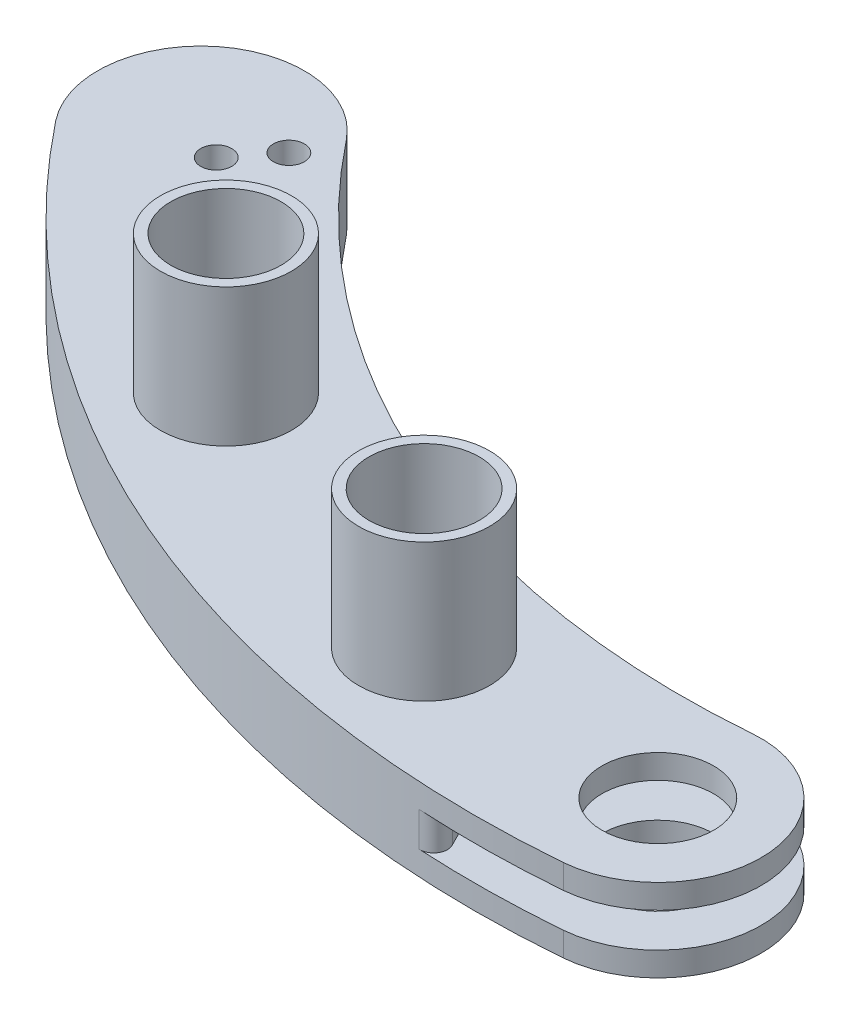
ISO-10303-21;
HEADER;
FILE_DESCRIPTION(('STEP AP214'),'2;1');
FILE_NAME('part.step','',(''),(''),'','','');
FILE_SCHEMA(('AUTOMOTIVE_DESIGN { 1 0 10303 214 1 1 1 1 }'));
ENDSEC;
DATA;
#1=APPLICATION_CONTEXT('core data for automotive mechanical design processes');
#2=APPLICATION_PROTOCOL_DEFINITION('international standard','automotive_design',2000,#1);
#3=PRODUCT_CONTEXT('',#1,'mechanical');
#4=PRODUCT('Part','Part','',(#3));
#5=PRODUCT_RELATED_PRODUCT_CATEGORY('part','',(#4));
#6=PRODUCT_DEFINITION_FORMATION('','',#4);
#7=PRODUCT_DEFINITION_CONTEXT('part definition',#1,'design');
#8=PRODUCT_DEFINITION('design','',#6,#7);
#9=PRODUCT_DEFINITION_SHAPE('','',#8);
#10=(LENGTH_UNIT() NAMED_UNIT(*) SI_UNIT(.MILLI.,.METRE.));
#11=(NAMED_UNIT(*) PLANE_ANGLE_UNIT() SI_UNIT($,.RADIAN.));
#12=(NAMED_UNIT(*) SI_UNIT($,.STERADIAN.) SOLID_ANGLE_UNIT());
#13=UNCERTAINTY_MEASURE_WITH_UNIT(LENGTH_MEASURE(1.E-05),#10,'distance_accuracy_value','');
#14=(GEOMETRIC_REPRESENTATION_CONTEXT(3) GLOBAL_UNCERTAINTY_ASSIGNED_CONTEXT((#13)) GLOBAL_UNIT_ASSIGNED_CONTEXT((#10,
#11,#12)) REPRESENTATION_CONTEXT('',''));
#15=CARTESIAN_POINT('',(0.,0.,0.));
#16=DIRECTION('',(0.,0.,1.));
#17=DIRECTION('',(1.,0.,0.));
#18=AXIS2_PLACEMENT_3D('',#15,#16,#17);
#19=CARTESIAN_POINT('',(-11.1561222970679,12.,-134.5382508259));
#20=DIRECTION('',(0.,-1.,0.));
#21=DIRECTION('',(0.,0.,-1.));
#22=AXIS2_PLACEMENT_3D('',#19,#20,#21);
#23=CYLINDRICAL_SURFACE('',#22,120.);
#24=DIRECTION('',(0.,-1.,0.));
#25=VECTOR('',#24,1.);
#26=CARTESIAN_POINT('',(-23.8009389622773,12.,-15.2063246221251));
#27=LINE('',#26,#25);
#28=CARTESIAN_POINT('',(-23.8009389622773,8.5,-15.2063246221251));
#29=VERTEX_POINT('',#28);
#30=CARTESIAN_POINT('',(-23.8009389622773,3.5,-15.2063246221251));
#31=VERTEX_POINT('',#30);
#32=EDGE_CURVE('E201',#29,#31,#27,.T.);
#33=ORIENTED_EDGE('',*,*,#32,.T.);
#34=CARTESIAN_POINT('',(-11.1561222970679,3.5,-134.5382508259));
#35=DIRECTION('',(0.,1.,0.));
#36=DIRECTION('',(0.,0.,1.));
#37=AXIS2_PLACEMENT_3D('',#34,#35,#36);
#38=CIRCLE('',#37,120.);
#39=CARTESIAN_POINT('',(-1.23956914411867,3.5,-14.9486945362111));
#40=VERTEX_POINT('',#39);
#41=EDGE_CURVE('E151',#31,#40,#38,.T.);
#42=ORIENTED_EDGE('',*,*,#41,.T.);
#43=DIRECTION('',(0.,-1.,0.));
#44=VECTOR('',#43,1.);
#45=CARTESIAN_POINT('',(-1.23956914411867,3.5,-14.9486945362111));
#46=LINE('',#45,#44);
#47=CARTESIAN_POINT('',(-1.23956914411867,0.,-14.9486945362111));
#48=VERTEX_POINT('',#47);
#49=EDGE_CURVE('E138',#40,#48,#46,.T.);
#50=ORIENTED_EDGE('',*,*,#49,.T.);
#51=CARTESIAN_POINT('',(-11.1561222970679,0.,-134.5382508259));
#52=DIRECTION('',(0.,1.,0.));
#53=DIRECTION('',(0.,0.,1.));
#54=AXIS2_PLACEMENT_3D('',#51,#52,#53);
#55=CIRCLE('',#54,120.);
#56=CARTESIAN_POINT('',(-105.239569144119,0.,-60.0513054637889));
#57=VERTEX_POINT('',#56);
#58=EDGE_CURVE('E178',#57,#48,#55,.T.);
#59=ORIENTED_EDGE('',*,*,#58,.F.);
#60=DIRECTION('',(0.,-1.,0.));
#61=VECTOR('',#60,1.);
#62=CARTESIAN_POINT('',(-105.239569144119,12.,-60.0513054637889));
#63=LINE('',#62,#61);
#64=CARTESIAN_POINT('',(-105.239569144119,12.,-60.0513054637889));
#65=VERTEX_POINT('',#64);
#66=EDGE_CURVE('E198',#65,#57,#63,.T.);
#67=ORIENTED_EDGE('',*,*,#66,.F.);
#68=CARTESIAN_POINT('',(-11.1561222970679,12.,-134.5382508259));
#69=DIRECTION('',(0.,1.,0.));
#70=DIRECTION('',(0.,0.,1.));
#71=AXIS2_PLACEMENT_3D('',#68,#69,#70);
#72=CIRCLE('',#71,120.);
#73=CARTESIAN_POINT('',(-1.23956914411867,12.,-14.9486945362111));
#74=VERTEX_POINT('',#73);
#75=EDGE_CURVE('E179',#65,#74,#72,.T.);
#76=ORIENTED_EDGE('',*,*,#75,.T.);
#77=DIRECTION('',(0.,-1.,0.));
#78=VECTOR('',#77,1.);
#79=CARTESIAN_POINT('',(-1.23956914411867,3.5,-14.9486945362111));
#80=LINE('',#79,#78);
#81=CARTESIAN_POINT('',(-1.23956914411867,8.5,-14.9486945362111));
#82=VERTEX_POINT('',#81);
#83=EDGE_CURVE('E170',#74,#82,#80,.T.);
#84=ORIENTED_EDGE('',*,*,#83,.T.);
#85=CARTESIAN_POINT('',(-11.1561222970679,8.5,-134.5382508259));
#86=DIRECTION('',(0.,1.,0.));
#87=DIRECTION('',(0.,0.,1.));
#88=AXIS2_PLACEMENT_3D('',#85,#86,#87);
#89=CIRCLE('',#88,120.);
#90=EDGE_CURVE('E137',#29,#82,#89,.T.);
#91=ORIENTED_EDGE('',*,*,#90,.F.);
#92=EDGE_LOOP('',(#33,#42,#50,#59,#67,#76,#84,#91));
#93=FACE_BOUND('',#92,.T.);
#94=ADVANCED_FACE('F41',(#93),#23,.F.);
#95=CARTESIAN_POINT('',(-11.1561222970679,12.,-134.5382508259));
#96=DIRECTION('',(0.,-1.,0.));
#97=DIRECTION('',(0.,0.,-1.));
#98=AXIS2_PLACEMENT_3D('',#95,#96,#97);
#99=CYLINDRICAL_SURFACE('',#98,150.);
#100=CARTESIAN_POINT('',(-11.1561222970679,3.5,-134.5382508259));
#101=DIRECTION('',(0.,1.,0.));
#102=DIRECTION('',(0.,0.,1.));
#103=AXIS2_PLACEMENT_3D('',#100,#101,#102);
#104=CIRCLE('',#103,150.);
#105=CARTESIAN_POINT('',(-19.3809595649369,3.5,15.2360862679993));
#106=VERTEX_POINT('',#105);
#107=CARTESIAN_POINT('',(1.23956914411865,3.5,14.9486945362112));
#108=VERTEX_POINT('',#107);
#109=EDGE_CURVE('E57',#106,#108,#104,.T.);
#110=ORIENTED_EDGE('',*,*,#109,.F.);
#111=DIRECTION('',(0.,-1.,0.));
#112=VECTOR('',#111,1.);
#113=CARTESIAN_POINT('',(-19.3809595649369,12.,15.2360862679993));
#114=LINE('',#113,#112);
#115=CARTESIAN_POINT('',(-19.3809595649369,8.5,15.2360862679993));
#116=VERTEX_POINT('',#115);
#117=EDGE_CURVE('E224',#106,#116,#114,.F.);
#118=ORIENTED_EDGE('',*,*,#117,.T.);
#119=CARTESIAN_POINT('',(-11.1561222970679,8.5,-134.5382508259));
#120=DIRECTION('',(0.,1.,0.));
#121=DIRECTION('',(0.,0.,1.));
#122=AXIS2_PLACEMENT_3D('',#119,#120,#121);
#123=CIRCLE('',#122,150.);
#124=CARTESIAN_POINT('',(1.23956914411865,8.5,14.9486945362112));
#125=VERTEX_POINT('',#124);
#126=EDGE_CURVE('E65',#116,#125,#123,.T.);
#127=ORIENTED_EDGE('',*,*,#126,.T.);
#128=DIRECTION('',(0.,-1.,0.));
#129=VECTOR('',#128,1.);
#130=CARTESIAN_POINT('',(1.23956914411865,3.5,14.9486945362112));
#131=LINE('',#130,#129);
#132=CARTESIAN_POINT('',(1.23956914411865,12.,14.9486945362112));
#133=VERTEX_POINT('',#132);
#134=EDGE_CURVE('E174',#133,#125,#131,.T.);
#135=ORIENTED_EDGE('',*,*,#134,.F.);
#136=CARTESIAN_POINT('',(-11.1561222970679,12.,-134.5382508259));
#137=DIRECTION('',(0.,1.,0.));
#138=DIRECTION('',(0.,0.,1.));
#139=AXIS2_PLACEMENT_3D('',#136,#137,#138);
#140=CIRCLE('',#139,150.);
#141=CARTESIAN_POINT('',(-128.760430855881,12.,-41.429569123261));
#142=VERTEX_POINT('',#141);
#143=EDGE_CURVE('E185',#142,#133,#140,.T.);
#144=ORIENTED_EDGE('',*,*,#143,.F.);
#145=DIRECTION('',(0.,-1.,0.));
#146=VECTOR('',#145,1.);
#147=CARTESIAN_POINT('',(-128.760430855881,12.,-41.429569123261));
#148=LINE('',#147,#146);
#149=CARTESIAN_POINT('',(-128.760430855881,0.,-41.429569123261));
#150=VERTEX_POINT('',#149);
#151=EDGE_CURVE('E188',#142,#150,#148,.T.);
#152=ORIENTED_EDGE('',*,*,#151,.T.);
#153=CARTESIAN_POINT('',(-11.1561222970679,0.,-134.5382508259));
#154=DIRECTION('',(0.,1.,0.));
#155=DIRECTION('',(0.,0.,1.));
#156=AXIS2_PLACEMENT_3D('',#153,#154,#155);
#157=CIRCLE('',#156,150.);
#158=CARTESIAN_POINT('',(1.23956914411865,0.,14.9486945362112));
#159=VERTEX_POINT('',#158);
#160=EDGE_CURVE('E132',#150,#159,#157,.T.);
#161=ORIENTED_EDGE('',*,*,#160,.T.);
#162=DIRECTION('',(0.,-1.,0.));
#163=VECTOR('',#162,1.);
#164=CARTESIAN_POINT('',(1.23956914411865,3.5,14.9486945362112));
#165=LINE('',#164,#163);
#166=EDGE_CURVE('E128',#108,#159,#165,.T.);
#167=ORIENTED_EDGE('',*,*,#166,.F.);
#168=EDGE_LOOP('',(#110,#118,#127,#135,#144,#152,#161,#167));
#169=FACE_BOUND('',#168,.T.);
#170=ADVANCED_FACE('F129',(#169),#99,.T.);
#171=CARTESIAN_POINT('',(-117.,12.,-50.7404372935249));
#172=DIRECTION('',(0.,-1.,0.));
#173=DIRECTION('',(0.,0.,-1.));
#174=AXIS2_PLACEMENT_3D('',#171,#172,#173);
#175=CYLINDRICAL_SURFACE('',#174,15.);
#176=CARTESIAN_POINT('',(-117.,0.,-50.7404372935249));
#177=DIRECTION('',(0.,1.,0.));
#178=DIRECTION('',(0.,0.,1.));
#179=AXIS2_PLACEMENT_3D('',#176,#177,#178);
#180=CIRCLE('',#179,15.);
#181=EDGE_CURVE('E191',#57,#150,#180,.T.);
#182=ORIENTED_EDGE('',*,*,#181,.T.);
#183=ORIENTED_EDGE('',*,*,#151,.F.);
#184=CARTESIAN_POINT('',(-117.,12.,-50.7404372935249));
#185=DIRECTION('',(0.,1.,0.));
#186=DIRECTION('',(0.,0.,1.));
#187=AXIS2_PLACEMENT_3D('',#184,#185,#186);
#188=CIRCLE('',#187,15.);
#189=EDGE_CURVE('E182',#65,#142,#188,.T.);
#190=ORIENTED_EDGE('',*,*,#189,.F.);
#191=ORIENTED_EDGE('',*,*,#66,.T.);
#192=EDGE_LOOP('',(#182,#183,#190,#191));
#193=FACE_BOUND('',#192,.T.);
#194=ADVANCED_FACE('F257',(#193),#175,.T.);
#195=CARTESIAN_POINT('',(0.,12.,0.));
#196=DIRECTION('',(0.,1.,0.));
#197=DIRECTION('',(0.,0.,1.));
#198=AXIS2_PLACEMENT_3D('',#195,#196,#197);
#199=PLANE('',#198);
#200=CARTESIAN_POINT('',(-82.2471679808014,12.,-19.6042898686989));
#201=DIRECTION('',(0.,1.,0.));
#202=DIRECTION('',(0.,0.,1.));
#203=AXIS2_PLACEMENT_3D('',#200,#201,#202);
#204=CIRCLE('',#203,9.49999999999999);
#205=CARTESIAN_POINT('',(-82.2471679808014,12.,-10.1042898686989));
#206=VERTEX_POINT('',#205);
#207=EDGE_CURVE('E351',#206,#206,#204,.T.);
#208=ORIENTED_EDGE('',*,*,#207,.F.);
#209=EDGE_LOOP('',(#208));
#210=FACE_BOUND('',#209,.T.);
#211=CARTESIAN_POINT('',(-35.8241328303627,12.,-1.92782648449302));
#212=DIRECTION('',(0.,1.,0.));
#213=DIRECTION('',(0.,0.,1.));
#214=AXIS2_PLACEMENT_3D('',#211,#212,#213);
#215=CIRCLE('',#214,9.5);
#216=CARTESIAN_POINT('',(-35.8241328303627,12.,7.57217351550698));
#217=VERTEX_POINT('',#216);
#218=EDGE_CURVE('E339',#217,#217,#215,.T.);
#219=ORIENTED_EDGE('',*,*,#218,.F.);
#220=EDGE_LOOP('',(#219));
#221=FACE_BOUND('',#220,.T.);
#222=CARTESIAN_POINT('',(-107.816607253969,12.,-54.3024904049805));
#223=DIRECTION('',(0.,1.,0.));
#224=DIRECTION('',(0.,0.,1.));
#225=AXIS2_PLACEMENT_3D('',#222,#223,#224);
#226=CIRCLE('',#225,2.25);
#227=CARTESIAN_POINT('',(-107.816607253969,12.,-52.0524904049805));
#228=VERTEX_POINT('',#227);
#229=EDGE_CURVE('E332',#228,#228,#226,.T.);
#230=ORIENTED_EDGE('',*,*,#229,.F.);
#231=EDGE_LOOP('',(#230));
#232=FACE_BOUND('',#231,.T.);
#233=CARTESIAN_POINT('',(-112.49908312254,12.,-48.4437857921633));
#234=DIRECTION('',(0.,1.,0.));
#235=DIRECTION('',(0.,0.,1.));
#236=AXIS2_PLACEMENT_3D('',#233,#234,#235);
#237=CIRCLE('',#236,2.25);
#238=CARTESIAN_POINT('',(-112.49908312254,12.,-46.1937857921633));
#239=VERTEX_POINT('',#238);
#240=EDGE_CURVE('E323',#239,#239,#237,.T.);
#241=ORIENTED_EDGE('',*,*,#240,.F.);
#242=EDGE_LOOP('',(#241));
#243=FACE_BOUND('',#242,.T.);
#244=CARTESIAN_POINT('',(0.,12.,0.));
#245=DIRECTION('',(0.,1.,0.));
#246=DIRECTION('',(0.,0.,1.));
#247=AXIS2_PLACEMENT_3D('',#244,#245,#246);
#248=CIRCLE('',#247,8.1);
#249=CARTESIAN_POINT('',(0.,12.,8.1));
#250=VERTEX_POINT('',#249);
#251=EDGE_CURVE('E315',#250,#250,#248,.T.);
#252=ORIENTED_EDGE('',*,*,#251,.F.);
#253=EDGE_LOOP('',(#252));
#254=FACE_BOUND('',#253,.T.);
#255=ORIENTED_EDGE('',*,*,#143,.T.);
#256=CARTESIAN_POINT('',(0.,12.,0.));
#257=DIRECTION('',(0.,1.,0.));
#258=DIRECTION('',(0.,0.,1.));
#259=AXIS2_PLACEMENT_3D('',#256,#257,#258);
#260=CIRCLE('',#259,15.);
#261=EDGE_CURVE('E166',#133,#74,#260,.T.);
#262=ORIENTED_EDGE('',*,*,#261,.T.);
#263=ORIENTED_EDGE('',*,*,#75,.F.);
#264=ORIENTED_EDGE('',*,*,#189,.T.);
#265=EDGE_LOOP('',(#255,#262,#263,#264));
#266=FACE_BOUND('',#265,.T.);
#267=ADVANCED_FACE('F241',(#210,#221,#232,#243,#254,#266),#199,.T.);
#268=CARTESIAN_POINT('',(0.,0.,0.));
#269=DIRECTION('',(0.,1.,0.));
#270=DIRECTION('',(0.,0.,1.));
#271=AXIS2_PLACEMENT_3D('',#268,#269,#270);
#272=PLANE('',#271);
#273=CARTESIAN_POINT('',(-107.816607253969,0.,-54.3024904049805));
#274=DIRECTION('',(0.,1.,0.));
#275=DIRECTION('',(0.,0.,1.));
#276=AXIS2_PLACEMENT_3D('',#273,#274,#275);
#277=CIRCLE('',#276,2.25);
#278=CARTESIAN_POINT('',(-107.816607253969,0.,-52.0524904049805));
#279=VERTEX_POINT('',#278);
#280=EDGE_CURVE('E319',#279,#279,#277,.T.);
#281=ORIENTED_EDGE('',*,*,#280,.T.);
#282=EDGE_LOOP('',(#281));
#283=FACE_BOUND('',#282,.T.);
#284=CARTESIAN_POINT('',(-112.49908312254,0.,-48.4437857921633));
#285=DIRECTION('',(0.,1.,0.));
#286=DIRECTION('',(0.,0.,1.));
#287=AXIS2_PLACEMENT_3D('',#284,#285,#286);
#288=CIRCLE('',#287,2.25);
#289=CARTESIAN_POINT('',(-112.49908312254,0.,-46.1937857921633));
#290=VERTEX_POINT('',#289);
#291=EDGE_CURVE('E327',#290,#290,#288,.T.);
#292=ORIENTED_EDGE('',*,*,#291,.T.);
#293=EDGE_LOOP('',(#292));
#294=FACE_BOUND('',#293,.T.);
#295=CARTESIAN_POINT('',(0.,0.,0.));
#296=DIRECTION('',(0.,1.,0.));
#297=DIRECTION('',(0.,0.,1.));
#298=AXIS2_PLACEMENT_3D('',#295,#296,#297);
#299=CIRCLE('',#298,8.1);
#300=CARTESIAN_POINT('',(0.,0.,8.1));
#301=VERTEX_POINT('',#300);
#302=EDGE_CURVE('E206',#301,#301,#299,.T.);
#303=ORIENTED_EDGE('',*,*,#302,.T.);
#304=EDGE_LOOP('',(#303));
#305=FACE_BOUND('',#304,.T.);
#306=ORIENTED_EDGE('',*,*,#58,.T.);
#307=CARTESIAN_POINT('',(0.,0.,0.));
#308=DIRECTION('',(0.,1.,0.));
#309=DIRECTION('',(0.,0.,1.));
#310=AXIS2_PLACEMENT_3D('',#307,#308,#309);
#311=CIRCLE('',#310,15.);
#312=EDGE_CURVE('E149',#159,#48,#311,.T.);
#313=ORIENTED_EDGE('',*,*,#312,.F.);
#314=ORIENTED_EDGE('',*,*,#160,.F.);
#315=ORIENTED_EDGE('',*,*,#181,.F.);
#316=EDGE_LOOP('',(#306,#313,#314,#315));
#317=FACE_BOUND('',#316,.T.);
#318=ADVANCED_FACE('F256',(#283,#294,#305,#317),#272,.F.);
#319=CARTESIAN_POINT('',(0.,3.5,0.));
#320=DIRECTION('',(0.,-1.,0.));
#321=DIRECTION('',(0.,0.,-1.));
#322=AXIS2_PLACEMENT_3D('',#319,#320,#321);
#323=CYLINDRICAL_SURFACE('',#322,15.);
#324=ORIENTED_EDGE('',*,*,#134,.T.);
#325=CARTESIAN_POINT('',(0.,8.5,0.));
#326=DIRECTION('',(0.,1.,0.));
#327=DIRECTION('',(0.,0.,1.));
#328=AXIS2_PLACEMENT_3D('',#325,#326,#327);
#329=CIRCLE('',#328,15.);
#330=EDGE_CURVE('E162',#125,#82,#329,.T.);
#331=ORIENTED_EDGE('',*,*,#330,.T.);
#332=ORIENTED_EDGE('',*,*,#83,.F.);
#333=ORIENTED_EDGE('',*,*,#261,.F.);
#334=EDGE_LOOP('',(#324,#331,#332,#333));
#335=FACE_BOUND('',#334,.T.);
#336=ADVANCED_FACE('F298',(#335),#323,.T.);
#337=CARTESIAN_POINT('',(4.94575057272327,8.5,-0.508204869290588));
#338=DIRECTION('',(0.,-1.,0.));
#339=DIRECTION('',(0.,0.,-1.));
#340=AXIS2_PLACEMENT_3D('',#337,#338,#339);
#341=CYLINDRICAL_SURFACE('',#340,25.8469667324395);
#342=CARTESIAN_POINT('',(4.94575057272327,8.5,-0.508204869290588));
#343=DIRECTION('',(0.,1.,0.));
#344=DIRECTION('',(0.,0.,1.));
#345=AXIS2_PLACEMENT_3D('',#342,#343,#344);
#346=CIRCLE('',#345,25.8469667324395);
#347=CARTESIAN_POINT('',(-19.5828410970926,8.5,-8.65767601552298));
#348=VERTEX_POINT('',#347);
#349=CARTESIAN_POINT('',(-17.5320000221163,8.5,12.2517487930087));
#350=VERTEX_POINT('',#349);
#351=EDGE_CURVE('E156',#348,#350,#346,.T.);
#352=ORIENTED_EDGE('',*,*,#351,.T.);
#353=DIRECTION('',(0.,-1.,0.));
#354=VECTOR('',#353,1.);
#355=CARTESIAN_POINT('',(-17.5320000221163,8.5,12.2517487930087));
#356=LINE('',#355,#354);
#357=CARTESIAN_POINT('',(-17.5320000221163,3.5,12.2517487930087));
#358=VERTEX_POINT('',#357);
#359=EDGE_CURVE('E220',#350,#358,#356,.T.);
#360=ORIENTED_EDGE('',*,*,#359,.T.);
#361=CARTESIAN_POINT('',(4.94575057272327,3.5,-0.508204869290588));
#362=DIRECTION('',(0.,1.,0.));
#363=DIRECTION('',(0.,0.,1.));
#364=AXIS2_PLACEMENT_3D('',#361,#362,#363);
#365=CIRCLE('',#364,25.8469667324395);
#366=CARTESIAN_POINT('',(-19.5828410970926,3.5,-8.65767601552298));
#367=VERTEX_POINT('',#366);
#368=EDGE_CURVE('E125',#367,#358,#365,.T.);
#369=ORIENTED_EDGE('',*,*,#368,.F.);
#370=DIRECTION('',(0.,-1.,0.));
#371=VECTOR('',#370,1.);
#372=CARTESIAN_POINT('',(-19.5828410970926,8.5,-8.65767601552298));
#373=LINE('',#372,#371);
#374=EDGE_CURVE('E210',#367,#348,#373,.F.);
#375=ORIENTED_EDGE('',*,*,#374,.T.);
#376=EDGE_LOOP('',(#352,#360,#369,#375));
#377=FACE_BOUND('',#376,.T.);
#378=ADVANCED_FACE('F292',(#377),#341,.F.);
#379=CARTESIAN_POINT('',(0.,8.5,0.));
#380=DIRECTION('',(0.,1.,0.));
#381=DIRECTION('',(0.,0.,1.));
#382=AXIS2_PLACEMENT_3D('',#379,#380,#381);
#383=PLANE('',#382);
#384=CARTESIAN_POINT('',(0.,8.5,0.));
#385=DIRECTION('',(0.,1.,0.));
#386=DIRECTION('',(0.,0.,1.));
#387=AXIS2_PLACEMENT_3D('',#384,#385,#386);
#388=CIRCLE('',#387,8.1);
#389=CARTESIAN_POINT('',(0.,8.5,8.1));
#390=VERTEX_POINT('',#389);
#391=EDGE_CURVE('E152',#390,#390,#388,.T.);
#392=ORIENTED_EDGE('',*,*,#391,.T.);
#393=EDGE_LOOP('',(#392));
#394=FACE_BOUND('',#393,.T.);
#395=ORIENTED_EDGE('',*,*,#90,.T.);
#396=ORIENTED_EDGE('',*,*,#330,.F.);
#397=ORIENTED_EDGE('',*,*,#126,.F.);
#398=CARTESIAN_POINT('',(-19.271295068032,8.5,13.2390951067473));
#399=DIRECTION('',(0.,1.,0.));
#400=DIRECTION('',(0.,0.,1.));
#401=AXIS2_PLACEMENT_3D('',#398,#399,#400);
#402=CIRCLE('',#401,2.);
#403=EDGE_CURVE('E229',#116,#350,#402,.T.);
#404=ORIENTED_EDGE('',*,*,#403,.T.);
#405=ORIENTED_EDGE('',*,*,#351,.F.);
#406=CARTESIAN_POINT('',(-24.3278063233277,8.5,-10.2341610303012));
#407=DIRECTION('',(0.,1.,0.));
#408=DIRECTION('',(0.,0.,1.));
#409=AXIS2_PLACEMENT_3D('',#406,#407,#408);
#410=CIRCLE('',#409,5.);
#411=EDGE_CURVE('E216',#348,#29,#410,.T.);
#412=ORIENTED_EDGE('',*,*,#411,.T.);
#413=EDGE_LOOP('',(#395,#396,#397,#404,#405,#412));
#414=FACE_BOUND('',#413,.T.);
#415=ADVANCED_FACE('F288',(#394,#414),#383,.F.);
#416=CARTESIAN_POINT('',(0.,3.5,0.));
#417=DIRECTION('',(0.,-1.,0.));
#418=DIRECTION('',(0.,0.,-1.));
#419=AXIS2_PLACEMENT_3D('',#416,#417,#418);
#420=CYLINDRICAL_SURFACE('',#419,15.);
#421=ORIENTED_EDGE('',*,*,#312,.T.);
#422=ORIENTED_EDGE('',*,*,#49,.F.);
#423=CARTESIAN_POINT('',(0.,3.5,0.));
#424=DIRECTION('',(0.,1.,0.));
#425=DIRECTION('',(0.,0.,1.));
#426=AXIS2_PLACEMENT_3D('',#423,#424,#425);
#427=CIRCLE('',#426,15.);
#428=EDGE_CURVE('E119',#108,#40,#427,.T.);
#429=ORIENTED_EDGE('',*,*,#428,.F.);
#430=ORIENTED_EDGE('',*,*,#166,.T.);
#431=EDGE_LOOP('',(#421,#422,#429,#430));
#432=FACE_BOUND('',#431,.T.);
#433=ADVANCED_FACE('F140',(#432),#420,.T.);
#434=CARTESIAN_POINT('',(0.,3.5,0.));
#435=DIRECTION('',(0.,1.,0.));
#436=DIRECTION('',(0.,0.,1.));
#437=AXIS2_PLACEMENT_3D('',#434,#435,#436);
#438=PLANE('',#437);
#439=CARTESIAN_POINT('',(0.,3.5,0.));
#440=DIRECTION('',(0.,1.,0.));
#441=DIRECTION('',(0.,0.,1.));
#442=AXIS2_PLACEMENT_3D('',#439,#440,#441);
#443=CIRCLE('',#442,8.1);
#444=CARTESIAN_POINT('',(0.,3.5,8.1));
#445=VERTEX_POINT('',#444);
#446=EDGE_CURVE('E202',#445,#445,#443,.T.);
#447=ORIENTED_EDGE('',*,*,#446,.F.);
#448=EDGE_LOOP('',(#447));
#449=FACE_BOUND('',#448,.T.);
#450=ORIENTED_EDGE('',*,*,#41,.F.);
#451=CARTESIAN_POINT('',(-24.3278063233277,3.5,-10.2341610303012));
#452=DIRECTION('',(0.,1.,0.));
#453=DIRECTION('',(0.,0.,1.));
#454=AXIS2_PLACEMENT_3D('',#451,#452,#453);
#455=CIRCLE('',#454,5.);
#456=EDGE_CURVE('E213',#31,#367,#455,.F.);
#457=ORIENTED_EDGE('',*,*,#456,.T.);
#458=ORIENTED_EDGE('',*,*,#368,.T.);
#459=CARTESIAN_POINT('',(-19.271295068032,3.5,13.2390951067473));
#460=DIRECTION('',(0.,1.,0.));
#461=DIRECTION('',(0.,0.,1.));
#462=AXIS2_PLACEMENT_3D('',#459,#460,#461);
#463=CIRCLE('',#462,2.);
#464=EDGE_CURVE('E122',#358,#106,#463,.F.);
#465=ORIENTED_EDGE('',*,*,#464,.T.);
#466=ORIENTED_EDGE('',*,*,#109,.T.);
#467=ORIENTED_EDGE('',*,*,#428,.T.);
#468=EDGE_LOOP('',(#450,#457,#458,#465,#466,#467));
#469=FACE_BOUND('',#468,.T.);
#470=ADVANCED_FACE('F117',(#449,#469),#438,.T.);
#471=CARTESIAN_POINT('',(0.,0.,0.));
#472=DIRECTION('',(0.,1.,0.));
#473=DIRECTION('',(0.,0.,1.));
#474=AXIS2_PLACEMENT_3D('',#471,#472,#473);
#475=CYLINDRICAL_SURFACE('',#474,8.1);
#476=ORIENTED_EDGE('',*,*,#446,.T.);
#477=EDGE_LOOP('',(#476));
#478=FACE_BOUND('',#477,.T.);
#479=ORIENTED_EDGE('',*,*,#302,.F.);
#480=EDGE_LOOP('',(#479));
#481=FACE_BOUND('',#480,.T.);
#482=ADVANCED_FACE('F280',(#478,#481),#475,.F.);
#483=ORIENTED_EDGE('',*,*,#251,.T.);
#484=EDGE_LOOP('',(#483));
#485=FACE_BOUND('',#484,.T.);
#486=ORIENTED_EDGE('',*,*,#391,.F.);
#487=EDGE_LOOP('',(#486));
#488=FACE_BOUND('',#487,.T.);
#489=ADVANCED_FACE('F272',(#485,#488),#475,.F.);
#490=CARTESIAN_POINT('',(-24.3278063233277,8.5,-10.2341610303012));
#491=DIRECTION('',(0.,-1.,0.));
#492=DIRECTION('',(0.,0.,-1.));
#493=AXIS2_PLACEMENT_3D('',#490,#491,#492);
#494=CYLINDRICAL_SURFACE('',#493,5.);
#495=ORIENTED_EDGE('',*,*,#411,.F.);
#496=ORIENTED_EDGE('',*,*,#374,.F.);
#497=ORIENTED_EDGE('',*,*,#456,.F.);
#498=ORIENTED_EDGE('',*,*,#32,.F.);
#499=EDGE_LOOP('',(#495,#496,#497,#498));
#500=FACE_BOUND('',#499,.T.);
#501=ADVANCED_FACE('F270',(#500),#494,.T.);
#502=CARTESIAN_POINT('',(-19.271295068032,12.,13.2390951067473));
#503=DIRECTION('',(0.,1.,0.));
#504=DIRECTION('',(0.,0.,1.));
#505=AXIS2_PLACEMENT_3D('',#502,#503,#504);
#506=CYLINDRICAL_SURFACE('',#505,2.);
#507=ORIENTED_EDGE('',*,*,#403,.F.);
#508=ORIENTED_EDGE('',*,*,#117,.F.);
#509=ORIENTED_EDGE('',*,*,#464,.F.);
#510=ORIENTED_EDGE('',*,*,#359,.F.);
#511=EDGE_LOOP('',(#507,#508,#509,#510));
#512=FACE_BOUND('',#511,.T.);
#513=ADVANCED_FACE('F43',(#512),#506,.T.);
#514=CARTESIAN_POINT('',(-112.49908312254,0.,-48.4437857921633));
#515=DIRECTION('',(0.,1.,0.));
#516=DIRECTION('',(0.,0.,1.));
#517=AXIS2_PLACEMENT_3D('',#514,#515,#516);
#518=CYLINDRICAL_SURFACE('',#517,2.25);
#519=ORIENTED_EDGE('',*,*,#291,.F.);
#520=EDGE_LOOP('',(#519));
#521=FACE_BOUND('',#520,.T.);
#522=ORIENTED_EDGE('',*,*,#240,.T.);
#523=EDGE_LOOP('',(#522));
#524=FACE_BOUND('',#523,.T.);
#525=ADVANCED_FACE('F278',(#521,#524),#518,.F.);
#526=CARTESIAN_POINT('',(-107.816607253969,0.,-54.3024904049805));
#527=DIRECTION('',(0.,1.,0.));
#528=DIRECTION('',(0.,0.,1.));
#529=AXIS2_PLACEMENT_3D('',#526,#527,#528);
#530=CYLINDRICAL_SURFACE('',#529,2.25);
#531=ORIENTED_EDGE('',*,*,#280,.F.);
#532=EDGE_LOOP('',(#531));
#533=FACE_BOUND('',#532,.T.);
#534=ORIENTED_EDGE('',*,*,#229,.T.);
#535=EDGE_LOOP('',(#534));
#536=FACE_BOUND('',#535,.T.);
#537=ADVANCED_FACE('F377',(#533,#536),#530,.F.);
#538=CARTESIAN_POINT('',(-35.8241328303627,32.,-1.92782648449302));
#539=DIRECTION('',(0.,1.,0.));
#540=DIRECTION('',(0.,0.,1.));
#541=AXIS2_PLACEMENT_3D('',#538,#539,#540);
#542=PLANE('',#541);
#543=CARTESIAN_POINT('',(-35.8241328303627,32.,-1.92782648449302));
#544=DIRECTION('',(0.,1.,0.));
#545=DIRECTION('',(0.,0.,1.));
#546=AXIS2_PLACEMENT_3D('',#543,#544,#545);
#547=CIRCLE('',#546,9.5);
#548=CARTESIAN_POINT('',(-35.8241328303627,32.,7.57217351550698));
#549=VERTEX_POINT('',#548);
#550=EDGE_CURVE('E328',#549,#549,#547,.T.);
#551=ORIENTED_EDGE('',*,*,#550,.T.);
#552=EDGE_LOOP('',(#551));
#553=FACE_BOUND('',#552,.T.);
#554=CARTESIAN_POINT('',(-35.8241328303627,32.,-1.92782648449302));
#555=DIRECTION('',(0.,1.,0.));
#556=DIRECTION('',(0.,0.,1.));
#557=AXIS2_PLACEMENT_3D('',#554,#555,#556);
#558=CIRCLE('',#557,8.);
#559=CARTESIAN_POINT('',(-35.8241328303627,32.,6.07217351550698));
#560=VERTEX_POINT('',#559);
#561=EDGE_CURVE('E343',#560,#560,#558,.T.);
#562=ORIENTED_EDGE('',*,*,#561,.F.);
#563=EDGE_LOOP('',(#562));
#564=FACE_BOUND('',#563,.T.);
#565=ADVANCED_FACE('F374',(#553,#564),#542,.T.);
#566=CARTESIAN_POINT('',(-35.8241328303627,32.,-1.92782648449302));
#567=DIRECTION('',(0.,-1.,0.));
#568=DIRECTION('',(0.,0.,-1.));
#569=AXIS2_PLACEMENT_3D('',#566,#567,#568);
#570=CYLINDRICAL_SURFACE('',#569,9.5);
#571=ORIENTED_EDGE('',*,*,#550,.F.);
#572=EDGE_LOOP('',(#571));
#573=FACE_BOUND('',#572,.T.);
#574=ORIENTED_EDGE('',*,*,#218,.T.);
#575=EDGE_LOOP('',(#574));
#576=FACE_BOUND('',#575,.T.);
#577=ADVANCED_FACE('F250',(#573,#576),#570,.T.);
#578=CARTESIAN_POINT('',(-35.8241328303627,32.,-1.92782648449302));
#579=DIRECTION('',(0.,-1.,0.));
#580=DIRECTION('',(0.,0.,-1.));
#581=AXIS2_PLACEMENT_3D('',#578,#579,#580);
#582=CYLINDRICAL_SURFACE('',#581,8.);
#583=ORIENTED_EDGE('',*,*,#561,.T.);
#584=EDGE_LOOP('',(#583));
#585=FACE_BOUND('',#584,.T.);
#586=CARTESIAN_POINT('',(-35.8241328303627,12.,-1.92782648449302));
#587=DIRECTION('',(0.,1.,0.));
#588=DIRECTION('',(0.,0.,1.));
#589=AXIS2_PLACEMENT_3D('',#586,#587,#588);
#590=CIRCLE('',#589,8.);
#591=CARTESIAN_POINT('',(-35.8241328303627,12.,6.07217351550698));
#592=VERTEX_POINT('',#591);
#593=EDGE_CURVE('E50',#592,#592,#590,.F.);
#594=ORIENTED_EDGE('',*,*,#593,.T.);
#595=EDGE_LOOP('',(#594));
#596=FACE_BOUND('',#595,.T.);
#597=ADVANCED_FACE('F235',(#585,#596),#582,.F.);
#598=ORIENTED_EDGE('',*,*,#593,.F.);
#599=EDGE_LOOP('',(#598));
#600=FACE_BOUND('',#599,.T.);
#601=ADVANCED_FACE('F237',(#600),#199,.T.);
#602=CARTESIAN_POINT('',(-82.2471679808014,32.,-19.6042898686989));
#603=DIRECTION('',(0.,1.,0.));
#604=DIRECTION('',(0.,0.,1.));
#605=AXIS2_PLACEMENT_3D('',#602,#603,#604);
#606=PLANE('',#605);
#607=CARTESIAN_POINT('',(-82.2471679808014,32.,-19.6042898686989));
#608=DIRECTION('',(0.,1.,0.));
#609=DIRECTION('',(0.,0.,1.));
#610=AXIS2_PLACEMENT_3D('',#607,#608,#609);
#611=CIRCLE('',#610,9.49999999999999);
#612=CARTESIAN_POINT('',(-82.2471679808014,32.,-10.1042898686989));
#613=VERTEX_POINT('',#612);
#614=EDGE_CURVE('E350',#613,#613,#611,.T.);
#615=ORIENTED_EDGE('',*,*,#614,.T.);
#616=EDGE_LOOP('',(#615));
#617=FACE_BOUND('',#616,.T.);
#618=CARTESIAN_POINT('',(-82.2471679808014,32.,-19.6042898686989));
#619=DIRECTION('',(0.,1.,0.));
#620=DIRECTION('',(0.,0.,1.));
#621=AXIS2_PLACEMENT_3D('',#618,#619,#620);
#622=CIRCLE('',#621,8.);
#623=CARTESIAN_POINT('',(-82.2471679808014,32.,-11.6042898686989));
#624=VERTEX_POINT('',#623);
#625=EDGE_CURVE('E355',#624,#624,#622,.T.);
#626=ORIENTED_EDGE('',*,*,#625,.F.);
#627=EDGE_LOOP('',(#626));
#628=FACE_BOUND('',#627,.T.);
#629=ADVANCED_FACE('F239',(#617,#628),#606,.T.);
#630=CARTESIAN_POINT('',(-82.2471679808014,32.,-19.6042898686989));
#631=DIRECTION('',(0.,-1.,0.));
#632=DIRECTION('',(0.,0.,-1.));
#633=AXIS2_PLACEMENT_3D('',#630,#631,#632);
#634=CYLINDRICAL_SURFACE('',#633,9.49999999999999);
#635=ORIENTED_EDGE('',*,*,#614,.F.);
#636=EDGE_LOOP('',(#635));
#637=FACE_BOUND('',#636,.T.);
#638=ORIENTED_EDGE('',*,*,#207,.T.);
#639=EDGE_LOOP('',(#638));
#640=FACE_BOUND('',#639,.T.);
#641=ADVANCED_FACE('F247',(#637,#640),#634,.T.);
#642=CARTESIAN_POINT('',(-82.2471679808014,32.,-19.6042898686989));
#643=DIRECTION('',(0.,-1.,0.));
#644=DIRECTION('',(0.,0.,-1.));
#645=AXIS2_PLACEMENT_3D('',#642,#643,#644);
#646=CYLINDRICAL_SURFACE('',#645,8.);
#647=ORIENTED_EDGE('',*,*,#625,.T.);
#648=EDGE_LOOP('',(#647));
#649=FACE_BOUND('',#648,.T.);
#650=CARTESIAN_POINT('',(-82.2471679808014,12.,-19.6042898686989));
#651=DIRECTION('',(0.,1.,0.));
#652=DIRECTION('',(0.,0.,1.));
#653=AXIS2_PLACEMENT_3D('',#650,#651,#652);
#654=CIRCLE('',#653,8.);
#655=CARTESIAN_POINT('',(-82.2471679808014,12.,-11.6042898686989));
#656=VERTEX_POINT('',#655);
#657=EDGE_CURVE('E11',#656,#656,#654,.F.);
#658=ORIENTED_EDGE('',*,*,#657,.T.);
#659=EDGE_LOOP('',(#658));
#660=FACE_BOUND('',#659,.T.);
#661=ADVANCED_FACE('F260',(#649,#660),#646,.F.);
#662=ORIENTED_EDGE('',*,*,#657,.F.);
#663=EDGE_LOOP('',(#662));
#664=FACE_BOUND('',#663,.T.);
#665=ADVANCED_FACE('F242',(#664),#199,.T.);
#666=CLOSED_SHELL('',(#94,#170,#194,#267,#318,#336,#378,#415,#433,#470,#482,#489,#501,#513,#525,
#537,#565,#577,#597,#601,#629,#641,#661,#665));
#667=MANIFOLD_SOLID_BREP('B2',#666);
#668=ADVANCED_BREP_SHAPE_REPRESENTATION('',(#18,#667),#14);
#669=SHAPE_DEFINITION_REPRESENTATION(#9,#668);
ENDSEC;
END-ISO-10303-21;
